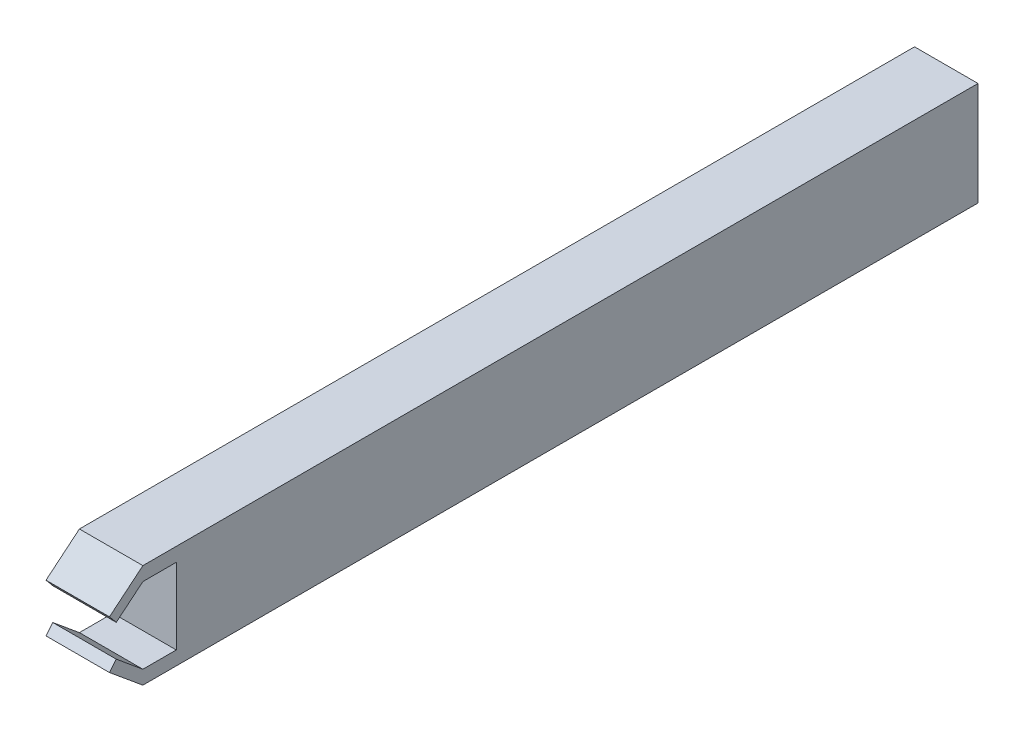
ISO-10303-21;
HEADER;
FILE_DESCRIPTION(('STEP AP214'),'2;1');
FILE_NAME('part.step','',(''),(''),'','','');
FILE_SCHEMA(('AUTOMOTIVE_DESIGN { 1 0 10303 214 1 1 1 1 }'));
ENDSEC;
DATA;
#1=APPLICATION_CONTEXT('core data for automotive mechanical design processes');
#2=APPLICATION_PROTOCOL_DEFINITION('international standard','automotive_design',2000,#1);
#3=PRODUCT_CONTEXT('',#1,'mechanical');
#4=PRODUCT('Part','Part','',(#3));
#5=PRODUCT_RELATED_PRODUCT_CATEGORY('part','',(#4));
#6=PRODUCT_DEFINITION_FORMATION('','',#4);
#7=PRODUCT_DEFINITION_CONTEXT('part definition',#1,'design');
#8=PRODUCT_DEFINITION('design','',#6,#7);
#9=PRODUCT_DEFINITION_SHAPE('','',#8);
#10=(LENGTH_UNIT() NAMED_UNIT(*) SI_UNIT(.MILLI.,.METRE.));
#11=(NAMED_UNIT(*) PLANE_ANGLE_UNIT() SI_UNIT($,.RADIAN.));
#12=(NAMED_UNIT(*) SI_UNIT($,.STERADIAN.) SOLID_ANGLE_UNIT());
#13=UNCERTAINTY_MEASURE_WITH_UNIT(LENGTH_MEASURE(1.E-05),#10,'distance_accuracy_value','');
#14=(GEOMETRIC_REPRESENTATION_CONTEXT(3) GLOBAL_UNCERTAINTY_ASSIGNED_CONTEXT((#13)) GLOBAL_UNIT_ASSIGNED_CONTEXT((#10,
#11,#12)) REPRESENTATION_CONTEXT('',''));
#15=CARTESIAN_POINT('',(0.,0.,0.));
#16=DIRECTION('',(0.,0.,1.));
#17=DIRECTION('',(1.,0.,0.));
#18=AXIS2_PLACEMENT_3D('',#15,#16,#17);
#19=CARTESIAN_POINT('',(9.5,-15.5,240.));
#20=DIRECTION('',(-1.,0.,0.));
#21=DIRECTION('',(0.,0.,1.));
#22=AXIS2_PLACEMENT_3D('',#19,#20,#21);
#23=PLANE('',#22);
#24=DIRECTION('',(0.,1.,0.));
#25=VECTOR('',#24,1.);
#26=CARTESIAN_POINT('',(9.5,-15.5,0.));
#27=LINE('',#26,#25);
#28=CARTESIAN_POINT('',(9.5,-15.5,0.));
#29=VERTEX_POINT('',#28);
#30=CARTESIAN_POINT('',(9.5,15.5,0.));
#31=VERTEX_POINT('',#30);
#32=EDGE_CURVE('E232',#29,#31,#27,.T.);
#33=ORIENTED_EDGE('',*,*,#32,.T.);
#34=DIRECTION('',(0.,0.,-1.));
#35=VECTOR('',#34,1.);
#36=CARTESIAN_POINT('',(9.5,15.5,240.));
#37=LINE('',#36,#35);
#38=CARTESIAN_POINT('',(9.5,15.5,250.));
#39=VERTEX_POINT('',#38);
#40=EDGE_CURVE('E11',#39,#31,#37,.T.);
#41=ORIENTED_EDGE('',*,*,#40,.F.);
#42=DIRECTION('',(0.,-0.637457546073027,0.770485481339236));
#43=VECTOR('',#42,1.);
#44=CARTESIAN_POINT('',(9.5,15.5,250.));
#45=LINE('',#44,#43);
#46=CARTESIAN_POINT('',(9.5,7.22654694329848,260.));
#47=VERTEX_POINT('',#46);
#48=EDGE_CURVE('E196',#39,#47,#45,.T.);
#49=ORIENTED_EDGE('',*,*,#48,.T.);
#50=DIRECTION('',(0.,-0.770485481339236,-0.637457546073027));
#51=VECTOR('',#50,1.);
#52=CARTESIAN_POINT('',(9.5,4.7707880222015,257.968239384773));
#53=LINE('',#52,#51);
#54=CARTESIAN_POINT('',(9.5,4.77078802220152,257.968239384773));
#55=VERTEX_POINT('',#54);
#56=EDGE_CURVE('E192',#47,#55,#53,.T.);
#57=ORIENTED_EDGE('',*,*,#56,.T.);
#58=DIRECTION('',(0.,0.637457546073026,-0.770485481339237));
#59=VECTOR('',#58,1.);
#60=CARTESIAN_POINT('',(9.5,11.3632734716493,250.));
#61=LINE('',#60,#59);
#62=CARTESIAN_POINT('',(9.5,11.3632734716493,250.));
#63=VERTEX_POINT('',#62);
#64=EDGE_CURVE('E189',#55,#63,#61,.T.);
#65=ORIENTED_EDGE('',*,*,#64,.T.);
#66=DIRECTION('',(0.,0.,-1.));
#67=VECTOR('',#66,1.);
#68=CARTESIAN_POINT('',(9.5,11.3632734716493,240.));
#69=LINE('',#68,#67);
#70=CARTESIAN_POINT('',(9.5,11.3632734716493,240.));
#71=VERTEX_POINT('',#70);
#72=EDGE_CURVE('E199',#63,#71,#69,.T.);
#73=ORIENTED_EDGE('',*,*,#72,.T.);
#74=DIRECTION('',(0.,1.,0.));
#75=VECTOR('',#74,1.);
#76=CARTESIAN_POINT('',(9.5,-15.5,240.));
#77=LINE('',#76,#75);
#78=CARTESIAN_POINT('',(9.5,-11.3632734716493,240.));
#79=VERTEX_POINT('',#78);
#80=EDGE_CURVE('E233',#79,#71,#77,.T.);
#81=ORIENTED_EDGE('',*,*,#80,.F.);
#82=DIRECTION('',(0.,0.,1.));
#83=VECTOR('',#82,1.);
#84=CARTESIAN_POINT('',(9.5,-11.3632734716493,240.));
#85=LINE('',#84,#83);
#86=CARTESIAN_POINT('',(9.5,-11.3632734716493,250.));
#87=VERTEX_POINT('',#86);
#88=EDGE_CURVE('E165',#79,#87,#85,.T.);
#89=ORIENTED_EDGE('',*,*,#88,.T.);
#90=DIRECTION('',(0.,0.637457546073026,0.770485481339237));
#91=VECTOR('',#90,1.);
#92=CARTESIAN_POINT('',(9.5,-11.3632734716493,250.));
#93=LINE('',#92,#91);
#94=CARTESIAN_POINT('',(9.5,-4.7707880222015,257.968239384773));
#95=VERTEX_POINT('',#94);
#96=EDGE_CURVE('E260',#87,#95,#93,.T.);
#97=ORIENTED_EDGE('',*,*,#96,.T.);
#98=DIRECTION('',(0.,-0.770485481339236,0.637457546073027));
#99=VECTOR('',#98,1.);
#100=CARTESIAN_POINT('',(9.5,-4.7707880222015,257.968239384773));
#101=LINE('',#100,#99);
#102=CARTESIAN_POINT('',(9.5,-7.22654694329848,260.));
#103=VERTEX_POINT('',#102);
#104=EDGE_CURVE('E177',#95,#103,#101,.T.);
#105=ORIENTED_EDGE('',*,*,#104,.T.);
#106=DIRECTION('',(0.,-0.637457546073027,-0.770485481339236));
#107=VECTOR('',#106,1.);
#108=CARTESIAN_POINT('',(9.5,-15.5,250.));
#109=LINE('',#108,#107);
#110=CARTESIAN_POINT('',(9.5,-15.5,250.));
#111=VERTEX_POINT('',#110);
#112=EDGE_CURVE('E186',#103,#111,#109,.T.);
#113=ORIENTED_EDGE('',*,*,#112,.T.);
#114=DIRECTION('',(0.,0.,-1.));
#115=VECTOR('',#114,1.);
#116=CARTESIAN_POINT('',(9.5,-15.5,240.));
#117=LINE('',#116,#115);
#118=EDGE_CURVE('E142',#111,#29,#117,.T.);
#119=ORIENTED_EDGE('',*,*,#118,.T.);
#120=EDGE_LOOP('',(#33,#41,#49,#57,#65,#73,#81,#89,#97,#105,#113,#119));
#121=FACE_BOUND('',#120,.T.);
#122=ADVANCED_FACE('F39',(#121),#23,.F.);
#123=CARTESIAN_POINT('',(-9.5,15.5,240.));
#124=DIRECTION('',(0.,-1.,0.));
#125=DIRECTION('',(0.,0.,-1.));
#126=AXIS2_PLACEMENT_3D('',#123,#124,#125);
#127=PLANE('',#126);
#128=DIRECTION('',(-1.,0.,0.));
#129=VECTOR('',#128,1.);
#130=CARTESIAN_POINT('',(-9.5,15.5,0.));
#131=LINE('',#130,#129);
#132=CARTESIAN_POINT('',(-9.5,15.5,0.));
#133=VERTEX_POINT('',#132);
#134=EDGE_CURVE('E242',#31,#133,#131,.T.);
#135=ORIENTED_EDGE('',*,*,#134,.T.);
#136=DIRECTION('',(0.,0.,-1.));
#137=VECTOR('',#136,1.);
#138=CARTESIAN_POINT('',(-9.5,15.5,240.));
#139=LINE('',#138,#137);
#140=CARTESIAN_POINT('',(-9.5,15.5,250.));
#141=VERTEX_POINT('',#140);
#142=EDGE_CURVE('E47',#141,#133,#139,.T.);
#143=ORIENTED_EDGE('',*,*,#142,.F.);
#144=DIRECTION('',(-1.,0.,0.));
#145=VECTOR('',#144,1.);
#146=CARTESIAN_POINT('',(32.1961668495923,15.5,250.));
#147=LINE('',#146,#145);
#148=EDGE_CURVE('E193',#39,#141,#147,.T.);
#149=ORIENTED_EDGE('',*,*,#148,.F.);
#150=ORIENTED_EDGE('',*,*,#40,.T.);
#151=EDGE_LOOP('',(#135,#143,#149,#150));
#152=FACE_BOUND('',#151,.T.);
#153=ADVANCED_FACE('F292',(#152),#127,.F.);
#154=CARTESIAN_POINT('',(-9.5,-15.5,240.));
#155=DIRECTION('',(1.,0.,0.));
#156=DIRECTION('',(0.,0.,-1.));
#157=AXIS2_PLACEMENT_3D('',#154,#155,#156);
#158=PLANE('',#157);
#159=DIRECTION('',(0.,-1.,0.));
#160=VECTOR('',#159,1.);
#161=CARTESIAN_POINT('',(-9.5,-15.5,0.));
#162=LINE('',#161,#160);
#163=CARTESIAN_POINT('',(-9.5,-15.5,0.));
#164=VERTEX_POINT('',#163);
#165=EDGE_CURVE('E138',#133,#164,#162,.T.);
#166=ORIENTED_EDGE('',*,*,#165,.T.);
#167=DIRECTION('',(0.,0.,-1.));
#168=VECTOR('',#167,1.);
#169=CARTESIAN_POINT('',(-9.5,-15.5,240.));
#170=LINE('',#169,#168);
#171=CARTESIAN_POINT('',(-9.5,-15.5,250.));
#172=VERTEX_POINT('',#171);
#173=EDGE_CURVE('E130',#172,#164,#170,.T.);
#174=ORIENTED_EDGE('',*,*,#173,.F.);
#175=DIRECTION('',(0.,0.637457546073027,0.770485481339236));
#176=VECTOR('',#175,1.);
#177=CARTESIAN_POINT('',(-9.5,-15.5,250.));
#178=LINE('',#177,#176);
#179=CARTESIAN_POINT('',(-9.5,-7.22654694329848,260.));
#180=VERTEX_POINT('',#179);
#181=EDGE_CURVE('E135',#172,#180,#178,.T.);
#182=ORIENTED_EDGE('',*,*,#181,.T.);
#183=DIRECTION('',(0.,0.770485481339236,-0.637457546073027));
#184=VECTOR('',#183,1.);
#185=CARTESIAN_POINT('',(-9.5,-4.7707880222015,257.968239384773));
#186=LINE('',#185,#184);
#187=CARTESIAN_POINT('',(-9.5,-4.7707880222015,257.968239384773));
#188=VERTEX_POINT('',#187);
#189=EDGE_CURVE('E159',#180,#188,#186,.T.);
#190=ORIENTED_EDGE('',*,*,#189,.T.);
#191=DIRECTION('',(0.,-0.637457546073026,-0.770485481339237));
#192=VECTOR('',#191,1.);
#193=CARTESIAN_POINT('',(-9.5,-11.3632734716493,250.));
#194=LINE('',#193,#192);
#195=CARTESIAN_POINT('',(-9.5,-11.3632734716493,250.));
#196=VERTEX_POINT('',#195);
#197=EDGE_CURVE('E162',#188,#196,#194,.T.);
#198=ORIENTED_EDGE('',*,*,#197,.T.);
#199=DIRECTION('',(0.,0.,-1.));
#200=VECTOR('',#199,1.);
#201=CARTESIAN_POINT('',(-9.5,-11.3632734716493,240.));
#202=LINE('',#201,#200);
#203=CARTESIAN_POINT('',(-9.5,-11.3632734716493,240.));
#204=VERTEX_POINT('',#203);
#205=EDGE_CURVE('E153',#196,#204,#202,.T.);
#206=ORIENTED_EDGE('',*,*,#205,.T.);
#207=DIRECTION('',(0.,-1.,0.));
#208=VECTOR('',#207,1.);
#209=CARTESIAN_POINT('',(-9.5,-15.5,240.));
#210=LINE('',#209,#208);
#211=CARTESIAN_POINT('',(-9.5,11.3632734716493,240.));
#212=VERTEX_POINT('',#211);
#213=EDGE_CURVE('E54',#212,#204,#210,.T.);
#214=ORIENTED_EDGE('',*,*,#213,.F.);
#215=DIRECTION('',(0.,0.,1.));
#216=VECTOR('',#215,1.);
#217=CARTESIAN_POINT('',(-9.5,11.3632734716493,240.));
#218=LINE('',#217,#216);
#219=CARTESIAN_POINT('',(-9.5,11.3632734716493,250.));
#220=VERTEX_POINT('',#219);
#221=EDGE_CURVE('E62',#212,#220,#218,.T.);
#222=ORIENTED_EDGE('',*,*,#221,.T.);
#223=DIRECTION('',(0.,-0.637457546073026,0.770485481339237));
#224=VECTOR('',#223,1.);
#225=CARTESIAN_POINT('',(-9.5,11.3632734716493,250.));
#226=LINE('',#225,#224);
#227=CARTESIAN_POINT('',(-9.5,4.7707880222015,257.968239384773));
#228=VERTEX_POINT('',#227);
#229=EDGE_CURVE('E202',#220,#228,#226,.T.);
#230=ORIENTED_EDGE('',*,*,#229,.T.);
#231=DIRECTION('',(0.,0.770485481339236,0.637457546073027));
#232=VECTOR('',#231,1.);
#233=CARTESIAN_POINT('',(-9.5,4.7707880222015,257.968239384773));
#234=LINE('',#233,#232);
#235=CARTESIAN_POINT('',(-9.5,7.22654694329848,260.));
#236=VERTEX_POINT('',#235);
#237=EDGE_CURVE('E206',#228,#236,#234,.T.);
#238=ORIENTED_EDGE('',*,*,#237,.T.);
#239=DIRECTION('',(0.,0.637457546073027,-0.770485481339236));
#240=VECTOR('',#239,1.);
#241=CARTESIAN_POINT('',(-9.5,15.5,250.));
#242=LINE('',#241,#240);
#243=EDGE_CURVE('E210',#236,#141,#242,.T.);
#244=ORIENTED_EDGE('',*,*,#243,.T.);
#245=ORIENTED_EDGE('',*,*,#142,.T.);
#246=EDGE_LOOP('',(#166,#174,#182,#190,#198,#206,#214,#222,#230,#238,#244,#245));
#247=FACE_BOUND('',#246,.T.);
#248=ADVANCED_FACE('F132',(#247),#158,.F.);
#249=CARTESIAN_POINT('',(-9.5,-15.5,240.));
#250=DIRECTION('',(0.,1.,0.));
#251=DIRECTION('',(0.,0.,1.));
#252=AXIS2_PLACEMENT_3D('',#249,#250,#251);
#253=PLANE('',#252);
#254=DIRECTION('',(1.,0.,0.));
#255=VECTOR('',#254,1.);
#256=CARTESIAN_POINT('',(-9.5,-15.5,0.));
#257=LINE('',#256,#255);
#258=EDGE_CURVE('E236',#164,#29,#257,.T.);
#259=ORIENTED_EDGE('',*,*,#258,.T.);
#260=ORIENTED_EDGE('',*,*,#118,.F.);
#261=DIRECTION('',(-1.,0.,0.));
#262=VECTOR('',#261,1.);
#263=CARTESIAN_POINT('',(32.1961668495923,-15.5,250.));
#264=LINE('',#263,#262);
#265=EDGE_CURVE('E145',#111,#172,#264,.T.);
#266=ORIENTED_EDGE('',*,*,#265,.T.);
#267=ORIENTED_EDGE('',*,*,#173,.T.);
#268=EDGE_LOOP('',(#259,#260,#266,#267));
#269=FACE_BOUND('',#268,.T.);
#270=ADVANCED_FACE('F146',(#269),#253,.F.);
#271=CARTESIAN_POINT('',(0.,0.,240.));
#272=DIRECTION('',(0.,0.,-1.));
#273=DIRECTION('',(-1.,0.,0.));
#274=AXIS2_PLACEMENT_3D('',#271,#272,#273);
#275=PLANE('',#274);
#276=ORIENTED_EDGE('',*,*,#213,.T.);
#277=DIRECTION('',(-1.,0.,0.));
#278=VECTOR('',#277,1.);
#279=CARTESIAN_POINT('',(32.1961668495923,-11.3632734716493,240.));
#280=LINE('',#279,#278);
#281=EDGE_CURVE('E174',#79,#204,#280,.T.);
#282=ORIENTED_EDGE('',*,*,#281,.F.);
#283=ORIENTED_EDGE('',*,*,#80,.T.);
#284=DIRECTION('',(-1.,0.,0.));
#285=VECTOR('',#284,1.);
#286=CARTESIAN_POINT('',(32.1961668495923,11.3632734716493,240.));
#287=LINE('',#286,#285);
#288=EDGE_CURVE('E214',#71,#212,#287,.T.);
#289=ORIENTED_EDGE('',*,*,#288,.T.);
#290=EDGE_LOOP('',(#276,#282,#283,#289));
#291=FACE_BOUND('',#290,.T.);
#292=ADVANCED_FACE('F274',(#291),#275,.F.);
#293=CARTESIAN_POINT('',(0.,0.,0.));
#294=DIRECTION('',(0.,0.,-1.));
#295=DIRECTION('',(-1.,0.,0.));
#296=AXIS2_PLACEMENT_3D('',#293,#294,#295);
#297=PLANE('',#296);
#298=ORIENTED_EDGE('',*,*,#32,.F.);
#299=ORIENTED_EDGE('',*,*,#258,.F.);
#300=ORIENTED_EDGE('',*,*,#165,.F.);
#301=ORIENTED_EDGE('',*,*,#134,.F.);
#302=EDGE_LOOP('',(#298,#299,#300,#301));
#303=FACE_BOUND('',#302,.T.);
#304=ADVANCED_FACE('F256',(#303),#297,.T.);
#305=CARTESIAN_POINT('',(32.1961668495923,15.5,250.));
#306=DIRECTION('',(0.,0.770485481339236,0.637457546073027));
#307=DIRECTION('',(0.,-0.637457546073027,0.770485481339236));
#308=AXIS2_PLACEMENT_3D('',#305,#306,#307);
#309=PLANE('',#308);
#310=ORIENTED_EDGE('',*,*,#48,.F.);
#311=ORIENTED_EDGE('',*,*,#148,.T.);
#312=ORIENTED_EDGE('',*,*,#243,.F.);
#313=DIRECTION('',(-1.,0.,0.));
#314=VECTOR('',#313,1.);
#315=CARTESIAN_POINT('',(32.1961668495923,7.22654694329848,260.));
#316=LINE('',#315,#314);
#317=EDGE_CURVE('E218',#47,#236,#316,.T.);
#318=ORIENTED_EDGE('',*,*,#317,.F.);
#319=EDGE_LOOP('',(#310,#311,#312,#318));
#320=FACE_BOUND('',#319,.T.);
#321=ADVANCED_FACE('F304',(#320),#309,.T.);
#322=CARTESIAN_POINT('',(32.1961668495923,4.7707880222015,257.968239384773));
#323=DIRECTION('',(0.,-0.637457546073027,0.770485481339237));
#324=DIRECTION('',(0.,-0.770485481339236,-0.637457546073027));
#325=AXIS2_PLACEMENT_3D('',#322,#323,#324);
#326=PLANE('',#325);
#327=ORIENTED_EDGE('',*,*,#56,.F.);
#328=ORIENTED_EDGE('',*,*,#317,.T.);
#329=ORIENTED_EDGE('',*,*,#237,.F.);
#330=DIRECTION('',(-1.,0.,0.));
#331=VECTOR('',#330,1.);
#332=CARTESIAN_POINT('',(32.1961668495923,4.7707880222015,257.968239384773));
#333=LINE('',#332,#331);
#334=EDGE_CURVE('E221',#55,#228,#333,.T.);
#335=ORIENTED_EDGE('',*,*,#334,.F.);
#336=EDGE_LOOP('',(#327,#328,#329,#335));
#337=FACE_BOUND('',#336,.T.);
#338=ADVANCED_FACE('F287',(#337),#326,.T.);
#339=CARTESIAN_POINT('',(32.1961668495923,11.3632734716493,250.));
#340=DIRECTION('',(0.,-0.770485481339237,-0.637457546073026));
#341=DIRECTION('',(0.,0.637457546073026,-0.770485481339237));
#342=AXIS2_PLACEMENT_3D('',#339,#340,#341);
#343=PLANE('',#342);
#344=ORIENTED_EDGE('',*,*,#64,.F.);
#345=ORIENTED_EDGE('',*,*,#334,.T.);
#346=ORIENTED_EDGE('',*,*,#229,.F.);
#347=DIRECTION('',(-1.,0.,0.));
#348=VECTOR('',#347,1.);
#349=CARTESIAN_POINT('',(32.1961668495923,11.3632734716493,250.));
#350=LINE('',#349,#348);
#351=EDGE_CURVE('E224',#63,#220,#350,.T.);
#352=ORIENTED_EDGE('',*,*,#351,.F.);
#353=EDGE_LOOP('',(#344,#345,#346,#352));
#354=FACE_BOUND('',#353,.T.);
#355=ADVANCED_FACE('F280',(#354),#343,.T.);
#356=CARTESIAN_POINT('',(32.1961668495923,11.3632734716493,240.));
#357=DIRECTION('',(0.,-1.,0.));
#358=DIRECTION('',(0.,0.,-1.));
#359=AXIS2_PLACEMENT_3D('',#356,#357,#358);
#360=PLANE('',#359);
#361=ORIENTED_EDGE('',*,*,#72,.F.);
#362=ORIENTED_EDGE('',*,*,#351,.T.);
#363=ORIENTED_EDGE('',*,*,#221,.F.);
#364=ORIENTED_EDGE('',*,*,#288,.F.);
#365=EDGE_LOOP('',(#361,#362,#363,#364));
#366=FACE_BOUND('',#365,.T.);
#367=ADVANCED_FACE('F278',(#366),#360,.T.);
#368=CARTESIAN_POINT('',(32.1961668495923,-11.3632734716493,240.));
#369=DIRECTION('',(0.,1.,0.));
#370=DIRECTION('',(0.,0.,1.));
#371=AXIS2_PLACEMENT_3D('',#368,#369,#370);
#372=PLANE('',#371);
#373=ORIENTED_EDGE('',*,*,#88,.F.);
#374=ORIENTED_EDGE('',*,*,#281,.T.);
#375=ORIENTED_EDGE('',*,*,#205,.F.);
#376=DIRECTION('',(-1.,0.,0.));
#377=VECTOR('',#376,1.);
#378=CARTESIAN_POINT('',(32.1961668495923,-11.3632734716493,250.));
#379=LINE('',#378,#377);
#380=EDGE_CURVE('E178',#87,#196,#379,.T.);
#381=ORIENTED_EDGE('',*,*,#380,.F.);
#382=EDGE_LOOP('',(#373,#374,#375,#381));
#383=FACE_BOUND('',#382,.T.);
#384=ADVANCED_FACE('F273',(#383),#372,.T.);
#385=CARTESIAN_POINT('',(32.1961668495923,-11.3632734716493,250.));
#386=DIRECTION('',(0.,0.770485481339237,-0.637457546073026));
#387=DIRECTION('',(0.,0.637457546073026,0.770485481339237));
#388=AXIS2_PLACEMENT_3D('',#385,#386,#387);
#389=PLANE('',#388);
#390=ORIENTED_EDGE('',*,*,#96,.F.);
#391=ORIENTED_EDGE('',*,*,#380,.T.);
#392=ORIENTED_EDGE('',*,*,#197,.F.);
#393=DIRECTION('',(-1.,0.,0.));
#394=VECTOR('',#393,1.);
#395=CARTESIAN_POINT('',(32.1961668495923,-4.7707880222015,257.968239384773));
#396=LINE('',#395,#394);
#397=EDGE_CURVE('E181',#95,#188,#396,.T.);
#398=ORIENTED_EDGE('',*,*,#397,.F.);
#399=EDGE_LOOP('',(#390,#391,#392,#398));
#400=FACE_BOUND('',#399,.T.);
#401=ADVANCED_FACE('F269',(#400),#389,.T.);
#402=CARTESIAN_POINT('',(32.1961668495923,-4.7707880222015,257.968239384773));
#403=DIRECTION('',(0.,0.637457546073027,0.770485481339237));
#404=DIRECTION('',(0.,-0.770485481339236,0.637457546073027));
#405=AXIS2_PLACEMENT_3D('',#402,#403,#404);
#406=PLANE('',#405);
#407=ORIENTED_EDGE('',*,*,#104,.F.);
#408=ORIENTED_EDGE('',*,*,#397,.T.);
#409=ORIENTED_EDGE('',*,*,#189,.F.);
#410=DIRECTION('',(-1.,0.,0.));
#411=VECTOR('',#410,1.);
#412=CARTESIAN_POINT('',(32.1961668495923,-7.22654694329848,260.));
#413=LINE('',#412,#411);
#414=EDGE_CURVE('E152',#103,#180,#413,.T.);
#415=ORIENTED_EDGE('',*,*,#414,.F.);
#416=EDGE_LOOP('',(#407,#408,#409,#415));
#417=FACE_BOUND('',#416,.T.);
#418=ADVANCED_FACE('F265',(#417),#406,.T.);
#419=CARTESIAN_POINT('',(32.1961668495923,-15.5,250.));
#420=DIRECTION('',(0.,-0.770485481339236,0.637457546073027));
#421=DIRECTION('',(0.,-0.637457546073027,-0.770485481339236));
#422=AXIS2_PLACEMENT_3D('',#419,#420,#421);
#423=PLANE('',#422);
#424=ORIENTED_EDGE('',*,*,#112,.F.);
#425=ORIENTED_EDGE('',*,*,#414,.T.);
#426=ORIENTED_EDGE('',*,*,#181,.F.);
#427=ORIENTED_EDGE('',*,*,#265,.F.);
#428=EDGE_LOOP('',(#424,#425,#426,#427));
#429=FACE_BOUND('',#428,.T.);
#430=ADVANCED_FACE('F155',(#429),#423,.T.);
#431=CLOSED_SHELL('',(#122,#153,#248,#270,#292,#304,#321,#338,#355,#367,#384,#401,#418,#430));
#432=MANIFOLD_SOLID_BREP('B2',#431);
#433=ADVANCED_BREP_SHAPE_REPRESENTATION('',(#18,#432),#14);
#434=SHAPE_DEFINITION_REPRESENTATION(#9,#433);
ENDSEC;
END-ISO-10303-21;
